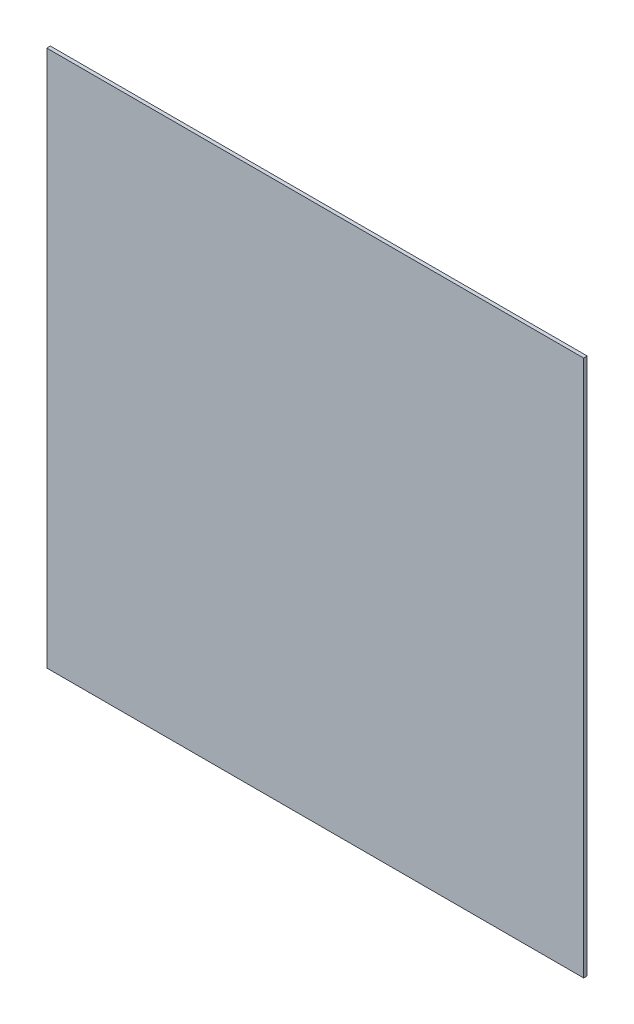
ISO-10303-21;
HEADER;
FILE_DESCRIPTION(('STEP AP214'),'2;1');
FILE_NAME('part.step','',(''),(''),'','','');
FILE_SCHEMA(('AUTOMOTIVE_DESIGN { 1 0 10303 214 1 1 1 1 }'));
ENDSEC;
DATA;
#1=APPLICATION_CONTEXT('core data for automotive mechanical design processes');
#2=APPLICATION_PROTOCOL_DEFINITION('international standard','automotive_design',2000,#1);
#3=PRODUCT_CONTEXT('',#1,'mechanical');
#4=PRODUCT('Part','Part','',(#3));
#5=PRODUCT_RELATED_PRODUCT_CATEGORY('part','',(#4));
#6=PRODUCT_DEFINITION_FORMATION('','',#4);
#7=PRODUCT_DEFINITION_CONTEXT('part definition',#1,'design');
#8=PRODUCT_DEFINITION('design','',#6,#7);
#9=PRODUCT_DEFINITION_SHAPE('','',#8);
#10=(LENGTH_UNIT() NAMED_UNIT(*) SI_UNIT(.MILLI.,.METRE.));
#11=(NAMED_UNIT(*) PLANE_ANGLE_UNIT() SI_UNIT($,.RADIAN.));
#12=(NAMED_UNIT(*) SI_UNIT($,.STERADIAN.) SOLID_ANGLE_UNIT());
#13=UNCERTAINTY_MEASURE_WITH_UNIT(LENGTH_MEASURE(1.E-05),#10,'distance_accuracy_value','');
#14=(GEOMETRIC_REPRESENTATION_CONTEXT(3) GLOBAL_UNCERTAINTY_ASSIGNED_CONTEXT((#13)) GLOBAL_UNIT_ASSIGNED_CONTEXT((#10,
#11,#12)) REPRESENTATION_CONTEXT('',''));
#15=CARTESIAN_POINT('',(0.,0.,0.));
#16=DIRECTION('',(0.,0.,1.));
#17=DIRECTION('',(1.,0.,0.));
#18=AXIS2_PLACEMENT_3D('',#15,#16,#17);
#19=CARTESIAN_POINT('',(0.,0.,1.));
#20=DIRECTION('',(1.,0.,0.));
#21=DIRECTION('',(0.,0.,-1.));
#22=AXIS2_PLACEMENT_3D('',#19,#20,#21);
#23=PLANE('',#22);
#24=DIRECTION('',(0.,-1.,0.));
#25=VECTOR('',#24,1.);
#26=CARTESIAN_POINT('',(0.,0.,0.));
#27=LINE('',#26,#25);
#28=CARTESIAN_POINT('',(0.,150.,0.));
#29=VERTEX_POINT('',#28);
#30=CARTESIAN_POINT('',(0.,0.,0.));
#31=VERTEX_POINT('',#30);
#32=EDGE_CURVE('E98',#29,#31,#27,.T.);
#33=ORIENTED_EDGE('',*,*,#32,.T.);
#34=DIRECTION('',(0.,0.,-1.));
#35=VECTOR('',#34,1.);
#36=CARTESIAN_POINT('',(0.,0.,1.));
#37=LINE('',#36,#35);
#38=CARTESIAN_POINT('',(0.,0.,1.));
#39=VERTEX_POINT('',#38);
#40=EDGE_CURVE('E11',#39,#31,#37,.T.);
#41=ORIENTED_EDGE('',*,*,#40,.F.);
#42=DIRECTION('',(0.,-1.,0.));
#43=VECTOR('',#42,1.);
#44=CARTESIAN_POINT('',(0.,0.,1.));
#45=LINE('',#44,#43);
#46=CARTESIAN_POINT('',(0.,150.,1.));
#47=VERTEX_POINT('',#46);
#48=EDGE_CURVE('E86',#47,#39,#45,.T.);
#49=ORIENTED_EDGE('',*,*,#48,.F.);
#50=DIRECTION('',(0.,0.,-1.));
#51=VECTOR('',#50,1.);
#52=CARTESIAN_POINT('',(0.,150.,1.));
#53=LINE('',#52,#51);
#54=EDGE_CURVE('E94',#47,#29,#53,.T.);
#55=ORIENTED_EDGE('',*,*,#54,.T.);
#56=EDGE_LOOP('',(#33,#41,#49,#55));
#57=FACE_BOUND('',#56,.T.);
#58=ADVANCED_FACE('F35',(#57),#23,.F.);
#59=CARTESIAN_POINT('',(0.,0.,1.));
#60=DIRECTION('',(0.,1.,0.));
#61=DIRECTION('',(0.,0.,1.));
#62=AXIS2_PLACEMENT_3D('',#59,#60,#61);
#63=PLANE('',#62);
#64=DIRECTION('',(1.,0.,0.));
#65=VECTOR('',#64,1.);
#66=CARTESIAN_POINT('',(0.,0.,0.));
#67=LINE('',#66,#65);
#68=CARTESIAN_POINT('',(150.,0.,0.));
#69=VERTEX_POINT('',#68);
#70=EDGE_CURVE('E90',#31,#69,#67,.T.);
#71=ORIENTED_EDGE('',*,*,#70,.T.);
#72=DIRECTION('',(0.,0.,-1.));
#73=VECTOR('',#72,1.);
#74=CARTESIAN_POINT('',(150.,0.,1.));
#75=LINE('',#74,#73);
#76=CARTESIAN_POINT('',(150.,0.,1.));
#77=VERTEX_POINT('',#76);
#78=EDGE_CURVE('E43',#77,#69,#75,.T.);
#79=ORIENTED_EDGE('',*,*,#78,.F.);
#80=DIRECTION('',(1.,0.,0.));
#81=VECTOR('',#80,1.);
#82=CARTESIAN_POINT('',(0.,0.,1.));
#83=LINE('',#82,#81);
#84=EDGE_CURVE('E81',#39,#77,#83,.T.);
#85=ORIENTED_EDGE('',*,*,#84,.F.);
#86=ORIENTED_EDGE('',*,*,#40,.T.);
#87=EDGE_LOOP('',(#71,#79,#85,#86));
#88=FACE_BOUND('',#87,.T.);
#89=ADVANCED_FACE('F89',(#88),#63,.F.);
#90=CARTESIAN_POINT('',(150.,0.,1.));
#91=DIRECTION('',(-1.,0.,0.));
#92=DIRECTION('',(0.,0.,1.));
#93=AXIS2_PLACEMENT_3D('',#90,#91,#92);
#94=PLANE('',#93);
#95=DIRECTION('',(0.,1.,0.));
#96=VECTOR('',#95,1.);
#97=CARTESIAN_POINT('',(150.,0.,0.));
#98=LINE('',#97,#96);
#99=CARTESIAN_POINT('',(150.,150.,0.));
#100=VERTEX_POINT('',#99);
#101=EDGE_CURVE('E68',#69,#100,#98,.T.);
#102=ORIENTED_EDGE('',*,*,#101,.T.);
#103=DIRECTION('',(0.,0.,-1.));
#104=VECTOR('',#103,1.);
#105=CARTESIAN_POINT('',(150.,150.,1.));
#106=LINE('',#105,#104);
#107=CARTESIAN_POINT('',(150.,150.,1.));
#108=VERTEX_POINT('',#107);
#109=EDGE_CURVE('E91',#108,#100,#106,.T.);
#110=ORIENTED_EDGE('',*,*,#109,.F.);
#111=DIRECTION('',(0.,1.,0.));
#112=VECTOR('',#111,1.);
#113=CARTESIAN_POINT('',(150.,0.,1.));
#114=LINE('',#113,#112);
#115=EDGE_CURVE('E84',#77,#108,#114,.T.);
#116=ORIENTED_EDGE('',*,*,#115,.F.);
#117=ORIENTED_EDGE('',*,*,#78,.T.);
#118=EDGE_LOOP('',(#102,#110,#116,#117));
#119=FACE_BOUND('',#118,.T.);
#120=ADVANCED_FACE('F92',(#119),#94,.F.);
#121=CARTESIAN_POINT('',(0.,150.,1.));
#122=DIRECTION('',(0.,-1.,0.));
#123=DIRECTION('',(0.,0.,-1.));
#124=AXIS2_PLACEMENT_3D('',#121,#122,#123);
#125=PLANE('',#124);
#126=DIRECTION('',(-1.,0.,0.));
#127=VECTOR('',#126,1.);
#128=CARTESIAN_POINT('',(0.,150.,0.));
#129=LINE('',#128,#127);
#130=EDGE_CURVE('E74',#100,#29,#129,.T.);
#131=ORIENTED_EDGE('',*,*,#130,.T.);
#132=ORIENTED_EDGE('',*,*,#54,.F.);
#133=DIRECTION('',(-1.,0.,0.));
#134=VECTOR('',#133,1.);
#135=CARTESIAN_POINT('',(0.,150.,1.));
#136=LINE('',#135,#134);
#137=EDGE_CURVE('E51',#108,#47,#136,.T.);
#138=ORIENTED_EDGE('',*,*,#137,.F.);
#139=ORIENTED_EDGE('',*,*,#109,.T.);
#140=EDGE_LOOP('',(#131,#132,#138,#139));
#141=FACE_BOUND('',#140,.T.);
#142=ADVANCED_FACE('F105',(#141),#125,.F.);
#143=CARTESIAN_POINT('',(0.,0.,1.));
#144=DIRECTION('',(0.,0.,-1.));
#145=DIRECTION('',(-1.,0.,0.));
#146=AXIS2_PLACEMENT_3D('',#143,#144,#145);
#147=PLANE('',#146);
#148=ORIENTED_EDGE('',*,*,#48,.T.);
#149=ORIENTED_EDGE('',*,*,#84,.T.);
#150=ORIENTED_EDGE('',*,*,#115,.T.);
#151=ORIENTED_EDGE('',*,*,#137,.T.);
#152=EDGE_LOOP('',(#148,#149,#150,#151));
#153=FACE_BOUND('',#152,.T.);
#154=ADVANCED_FACE('F82',(#153),#147,.F.);
#155=CARTESIAN_POINT('',(0.,0.,0.));
#156=DIRECTION('',(0.,0.,-1.));
#157=DIRECTION('',(-1.,0.,0.));
#158=AXIS2_PLACEMENT_3D('',#155,#156,#157);
#159=PLANE('',#158);
#160=ORIENTED_EDGE('',*,*,#32,.F.);
#161=ORIENTED_EDGE('',*,*,#130,.F.);
#162=ORIENTED_EDGE('',*,*,#101,.F.);
#163=ORIENTED_EDGE('',*,*,#70,.F.);
#164=EDGE_LOOP('',(#160,#161,#162,#163));
#165=FACE_BOUND('',#164,.T.);
#166=ADVANCED_FACE('F108',(#165),#159,.T.);
#167=CLOSED_SHELL('',(#58,#89,#120,#142,#154,#166));
#168=MANIFOLD_SOLID_BREP('B2',#167);
#169=ADVANCED_BREP_SHAPE_REPRESENTATION('',(#18,#168),#14);
#170=SHAPE_DEFINITION_REPRESENTATION(#9,#169);
ENDSEC;
END-ISO-10303-21;
